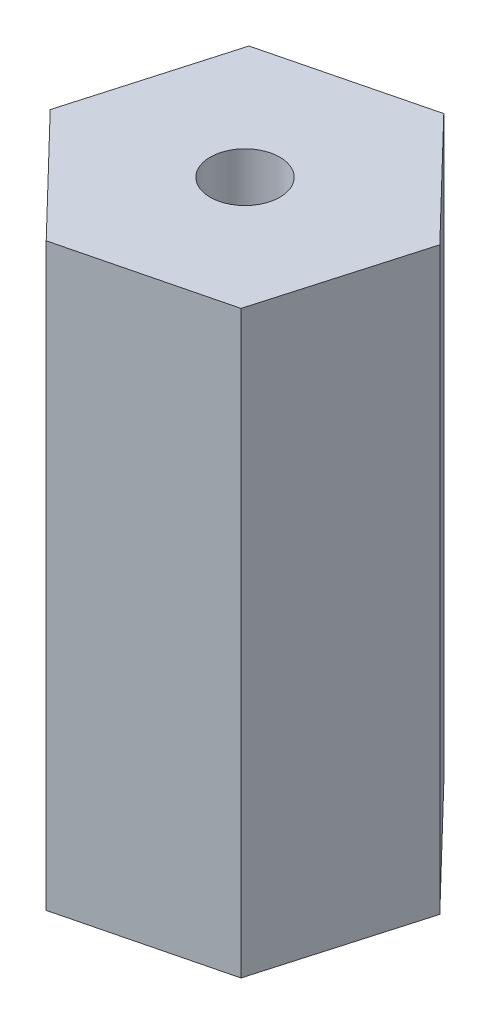
ISO-10303-21;
HEADER;
FILE_DESCRIPTION(('STEP AP214'),'2;1');
FILE_NAME('part.step','',(''),(''),'','','');
FILE_SCHEMA(('AUTOMOTIVE_DESIGN { 1 0 10303 214 1 1 1 1 }'));
ENDSEC;
DATA;
#1=APPLICATION_CONTEXT('core data for automotive mechanical design processes');
#2=APPLICATION_PROTOCOL_DEFINITION('international standard','automotive_design',2000,#1);
#3=PRODUCT_CONTEXT('',#1,'mechanical');
#4=PRODUCT('Part','Part','',(#3));
#5=PRODUCT_RELATED_PRODUCT_CATEGORY('part','',(#4));
#6=PRODUCT_DEFINITION_FORMATION('','',#4);
#7=PRODUCT_DEFINITION_CONTEXT('part definition',#1,'design');
#8=PRODUCT_DEFINITION('design','',#6,#7);
#9=PRODUCT_DEFINITION_SHAPE('','',#8);
#10=(LENGTH_UNIT() NAMED_UNIT(*) SI_UNIT(.MILLI.,.METRE.));
#11=(NAMED_UNIT(*) PLANE_ANGLE_UNIT() SI_UNIT($,.RADIAN.));
#12=(NAMED_UNIT(*) SI_UNIT($,.STERADIAN.) SOLID_ANGLE_UNIT());
#13=UNCERTAINTY_MEASURE_WITH_UNIT(LENGTH_MEASURE(1.E-05),#10,'distance_accuracy_value','');
#14=(GEOMETRIC_REPRESENTATION_CONTEXT(3) GLOBAL_UNCERTAINTY_ASSIGNED_CONTEXT((#13)) GLOBAL_UNIT_ASSIGNED_CONTEXT((#10,
#11,#12)) REPRESENTATION_CONTEXT('',''));
#15=CARTESIAN_POINT('',(0.,0.,0.));
#16=DIRECTION('',(0.,0.,1.));
#17=DIRECTION('',(1.,0.,0.));
#18=AXIS2_PLACEMENT_3D('',#15,#16,#17);
#19=CARTESIAN_POINT('',(-1.91026278693189,25.,6.65964684385465));
#20=DIRECTION('',(-0.241835763884429,0.,-0.970317197264088));
#21=DIRECTION('',(-0.970317197264088,0.,0.241835763884429));
#22=AXIS2_PLACEMENT_3D('',#19,#20,#21);
#23=PLANE('',#22);
#24=DIRECTION('',(0.970317197264088,0.,-0.241835763884429));
#25=VECTOR('',#24,1.);
#26=CARTESIAN_POINT('',(-1.91026278693189,0.,6.65964684385465));
#27=LINE('',#26,#25);
#28=CARTESIAN_POINT('',(-1.91026278693189,0.,6.65964684385465));
#29=VERTEX_POINT('',#28);
#30=CARTESIAN_POINT('',(4.81229195354504,0.,4.9841595233144));
#31=VERTEX_POINT('',#30);
#32=EDGE_CURVE('E117',#29,#31,#27,.T.);
#33=ORIENTED_EDGE('',*,*,#32,.T.);
#34=DIRECTION('',(0.,-1.,0.));
#35=VECTOR('',#34,1.);
#36=CARTESIAN_POINT('',(4.81229195354504,25.,4.9841595233144));
#37=LINE('',#36,#35);
#38=CARTESIAN_POINT('',(4.81229195354504,25.,4.9841595233144));
#39=VERTEX_POINT('',#38);
#40=EDGE_CURVE('E11',#39,#31,#37,.T.);
#41=ORIENTED_EDGE('',*,*,#40,.F.);
#42=DIRECTION('',(0.970317197264088,0.,-0.241835763884429));
#43=VECTOR('',#42,1.);
#44=CARTESIAN_POINT('',(-1.91026278693189,25.,6.65964684385465));
#45=LINE('',#44,#43);
#46=CARTESIAN_POINT('',(-1.91026278693189,25.,6.65964684385465));
#47=VERTEX_POINT('',#46);
#48=EDGE_CURVE('E128',#47,#39,#45,.T.);
#49=ORIENTED_EDGE('',*,*,#48,.F.);
#50=DIRECTION('',(0.,-1.,0.));
#51=VECTOR('',#50,1.);
#52=CARTESIAN_POINT('',(-1.91026278693189,25.,6.65964684385465));
#53=LINE('',#52,#51);
#54=EDGE_CURVE('E113',#47,#29,#53,.T.);
#55=ORIENTED_EDGE('',*,*,#54,.T.);
#56=EDGE_LOOP('',(#33,#41,#49,#55));
#57=FACE_BOUND('',#56,.T.);
#58=ADVANCED_FACE('F33',(#57),#23,.F.);
#59=CARTESIAN_POINT('',(4.81229195354504,25.,4.9841595233144));
#60=DIRECTION('',(-0.961237224501831,0.,-0.275722683564513));
#61=DIRECTION('',(-0.275722683564513,0.,0.961237224501831));
#62=AXIS2_PLACEMENT_3D('',#59,#60,#61);
#63=PLANE('',#62);
#64=DIRECTION('',(0.275722683564513,0.,-0.961237224501831));
#65=VECTOR('',#64,1.);
#66=CARTESIAN_POINT('',(4.81229195354504,0.,4.9841595233144));
#67=LINE('',#66,#65);
#68=CARTESIAN_POINT('',(6.72255474047693,0.,-1.67548732054025));
#69=VERTEX_POINT('',#68);
#70=EDGE_CURVE('E120',#31,#69,#67,.T.);
#71=ORIENTED_EDGE('',*,*,#70,.T.);
#72=DIRECTION('',(0.,-1.,0.));
#73=VECTOR('',#72,1.);
#74=CARTESIAN_POINT('',(6.72255474047693,25.,-1.67548732054025));
#75=LINE('',#74,#73);
#76=CARTESIAN_POINT('',(6.72255474047693,25.,-1.67548732054025));
#77=VERTEX_POINT('',#76);
#78=EDGE_CURVE('E41',#77,#69,#75,.T.);
#79=ORIENTED_EDGE('',*,*,#78,.F.);
#80=DIRECTION('',(0.275722683564513,0.,-0.961237224501831));
#81=VECTOR('',#80,1.);
#82=CARTESIAN_POINT('',(4.81229195354504,25.,4.9841595233144));
#83=LINE('',#82,#81);
#84=EDGE_CURVE('E86',#39,#77,#83,.T.);
#85=ORIENTED_EDGE('',*,*,#84,.F.);
#86=ORIENTED_EDGE('',*,*,#40,.T.);
#87=EDGE_LOOP('',(#71,#79,#85,#86));
#88=FACE_BOUND('',#87,.T.);
#89=ADVANCED_FACE('F153',(#88),#63,.F.);
#90=CARTESIAN_POINT('',(6.72255474047693,25.,-1.67548732054025));
#91=DIRECTION('',(-0.719401460617402,0.,0.694594513699575));
#92=DIRECTION('',(0.694594513699575,0.,0.719401460617402));
#93=AXIS2_PLACEMENT_3D('',#90,#91,#92);
#94=PLANE('',#93);
#95=DIRECTION('',(-0.694594513699575,0.,-0.719401460617402));
#96=VECTOR('',#95,1.);
#97=CARTESIAN_POINT('',(6.72255474047693,0.,-1.67548732054025));
#98=LINE('',#97,#96);
#99=CARTESIAN_POINT('',(1.91026278693189,0.,-6.65964684385465));
#100=VERTEX_POINT('',#99);
#101=EDGE_CURVE('E123',#69,#100,#98,.T.);
#102=ORIENTED_EDGE('',*,*,#101,.T.);
#103=DIRECTION('',(0.,-1.,0.));
#104=VECTOR('',#103,1.);
#105=CARTESIAN_POINT('',(1.91026278693189,25.,-6.65964684385465));
#106=LINE('',#105,#104);
#107=CARTESIAN_POINT('',(1.91026278693189,25.,-6.65964684385465));
#108=VERTEX_POINT('',#107);
#109=EDGE_CURVE('E108',#108,#100,#106,.T.);
#110=ORIENTED_EDGE('',*,*,#109,.F.);
#111=DIRECTION('',(-0.694594513699575,0.,-0.719401460617402));
#112=VECTOR('',#111,1.);
#113=CARTESIAN_POINT('',(6.72255474047693,25.,-1.67548732054025));
#114=LINE('',#113,#112);
#115=EDGE_CURVE('E99',#77,#108,#114,.T.);
#116=ORIENTED_EDGE('',*,*,#115,.F.);
#117=ORIENTED_EDGE('',*,*,#78,.T.);
#118=EDGE_LOOP('',(#102,#110,#116,#117));
#119=FACE_BOUND('',#118,.T.);
#120=ADVANCED_FACE('F134',(#119),#94,.F.);
#121=CARTESIAN_POINT('',(1.91026278693189,25.,-6.65964684385465));
#122=DIRECTION('',(0.241835763884429,0.,0.970317197264088));
#123=DIRECTION('',(0.970317197264088,0.,-0.241835763884429));
#124=AXIS2_PLACEMENT_3D('',#121,#122,#123);
#125=PLANE('',#124);
#126=DIRECTION('',(-0.970317197264088,0.,0.241835763884429));
#127=VECTOR('',#126,1.);
#128=CARTESIAN_POINT('',(1.91026278693189,0.,-6.65964684385465));
#129=LINE('',#128,#127);
#130=CARTESIAN_POINT('',(-4.81229195354504,0.,-4.9841595233144));
#131=VERTEX_POINT('',#130);
#132=EDGE_CURVE('E107',#100,#131,#129,.T.);
#133=ORIENTED_EDGE('',*,*,#132,.T.);
#134=DIRECTION('',(0.,-1.,0.));
#135=VECTOR('',#134,1.);
#136=CARTESIAN_POINT('',(-4.81229195354504,25.,-4.9841595233144));
#137=LINE('',#136,#135);
#138=CARTESIAN_POINT('',(-4.81229195354504,25.,-4.9841595233144));
#139=VERTEX_POINT('',#138);
#140=EDGE_CURVE('E104',#139,#131,#137,.T.);
#141=ORIENTED_EDGE('',*,*,#140,.F.);
#142=DIRECTION('',(-0.970317197264088,0.,0.241835763884429));
#143=VECTOR('',#142,1.);
#144=CARTESIAN_POINT('',(1.91026278693189,25.,-6.65964684385465));
#145=LINE('',#144,#143);
#146=EDGE_CURVE('E93',#108,#139,#145,.T.);
#147=ORIENTED_EDGE('',*,*,#146,.F.);
#148=ORIENTED_EDGE('',*,*,#109,.T.);
#149=EDGE_LOOP('',(#133,#141,#147,#148));
#150=FACE_BOUND('',#149,.T.);
#151=ADVANCED_FACE('F105',(#150),#125,.F.);
#152=CARTESIAN_POINT('',(-4.81229195354504,25.,-4.9841595233144));
#153=DIRECTION('',(0.961237224501831,0.,0.275722683564513));
#154=DIRECTION('',(0.275722683564513,0.,-0.961237224501831));
#155=AXIS2_PLACEMENT_3D('',#152,#153,#154);
#156=PLANE('',#155);
#157=DIRECTION('',(-0.275722683564513,0.,0.961237224501831));
#158=VECTOR('',#157,1.);
#159=CARTESIAN_POINT('',(-4.81229195354504,0.,-4.9841595233144));
#160=LINE('',#159,#158);
#161=CARTESIAN_POINT('',(-6.72255474047693,0.,1.67548732054025));
#162=VERTEX_POINT('',#161);
#163=EDGE_CURVE('E72',#131,#162,#160,.T.);
#164=ORIENTED_EDGE('',*,*,#163,.T.);
#165=DIRECTION('',(0.,-1.,0.));
#166=VECTOR('',#165,1.);
#167=CARTESIAN_POINT('',(-6.72255474047693,25.,1.67548732054025));
#168=LINE('',#167,#166);
#169=CARTESIAN_POINT('',(-6.72255474047693,25.,1.67548732054025));
#170=VERTEX_POINT('',#169);
#171=EDGE_CURVE('E109',#170,#162,#168,.T.);
#172=ORIENTED_EDGE('',*,*,#171,.F.);
#173=DIRECTION('',(-0.275722683564513,0.,0.961237224501831));
#174=VECTOR('',#173,1.);
#175=CARTESIAN_POINT('',(-4.81229195354504,25.,-4.9841595233144));
#176=LINE('',#175,#174);
#177=EDGE_CURVE('E97',#139,#170,#176,.T.);
#178=ORIENTED_EDGE('',*,*,#177,.F.);
#179=ORIENTED_EDGE('',*,*,#140,.T.);
#180=EDGE_LOOP('',(#164,#172,#178,#179));
#181=FACE_BOUND('',#180,.T.);
#182=ADVANCED_FACE('F111',(#181),#156,.F.);
#183=CARTESIAN_POINT('',(-6.72255474047693,25.,1.67548732054025));
#184=DIRECTION('',(0.719401460617402,0.,-0.694594513699575));
#185=DIRECTION('',(-0.694594513699575,0.,-0.719401460617402));
#186=AXIS2_PLACEMENT_3D('',#183,#184,#185);
#187=PLANE('',#186);
#188=DIRECTION('',(0.694594513699575,0.,0.719401460617402));
#189=VECTOR('',#188,1.);
#190=CARTESIAN_POINT('',(-6.72255474047693,0.,1.67548732054025));
#191=LINE('',#190,#189);
#192=EDGE_CURVE('E78',#162,#29,#191,.T.);
#193=ORIENTED_EDGE('',*,*,#192,.T.);
#194=ORIENTED_EDGE('',*,*,#54,.F.);
#195=DIRECTION('',(0.694594513699575,0.,0.719401460617402));
#196=VECTOR('',#195,1.);
#197=CARTESIAN_POINT('',(-6.72255474047693,25.,1.67548732054025));
#198=LINE('',#197,#196);
#199=EDGE_CURVE('E49',#170,#47,#198,.T.);
#200=ORIENTED_EDGE('',*,*,#199,.F.);
#201=ORIENTED_EDGE('',*,*,#171,.T.);
#202=EDGE_LOOP('',(#193,#194,#200,#201));
#203=FACE_BOUND('',#202,.T.);
#204=ADVANCED_FACE('F141',(#203),#187,.F.);
#205=CARTESIAN_POINT('',(0.,25.,0.));
#206=DIRECTION('',(0.,1.,0.));
#207=DIRECTION('',(0.,0.,1.));
#208=AXIS2_PLACEMENT_3D('',#205,#206,#207);
#209=PLANE('',#208);
#210=CARTESIAN_POINT('',(0.,25.,0.));
#211=DIRECTION('',(0.,1.,0.));
#212=DIRECTION('',(0.,0.,1.));
#213=AXIS2_PLACEMENT_3D('',#210,#211,#212);
#214=CIRCLE('',#213,1.5);
#215=CARTESIAN_POINT('',(0.,25.,1.5));
#216=VERTEX_POINT('',#215);
#217=EDGE_CURVE('E121',#216,#216,#214,.T.);
#218=ORIENTED_EDGE('',*,*,#217,.F.);
#219=EDGE_LOOP('',(#218));
#220=FACE_BOUND('',#219,.T.);
#221=ORIENTED_EDGE('',*,*,#48,.T.);
#222=ORIENTED_EDGE('',*,*,#84,.T.);
#223=ORIENTED_EDGE('',*,*,#115,.T.);
#224=ORIENTED_EDGE('',*,*,#146,.T.);
#225=ORIENTED_EDGE('',*,*,#177,.T.);
#226=ORIENTED_EDGE('',*,*,#199,.T.);
#227=EDGE_LOOP('',(#221,#222,#223,#224,#225,#226));
#228=FACE_BOUND('',#227,.T.);
#229=ADVANCED_FACE('F95',(#220,#228),#209,.T.);
#230=CARTESIAN_POINT('',(0.,0.,0.));
#231=DIRECTION('',(0.,1.,0.));
#232=DIRECTION('',(0.,0.,1.));
#233=AXIS2_PLACEMENT_3D('',#230,#231,#232);
#234=PLANE('',#233);
#235=CARTESIAN_POINT('',(0.,0.,0.));
#236=DIRECTION('',(0.,-1.,0.));
#237=DIRECTION('',(0.,0.,-1.));
#238=AXIS2_PLACEMENT_3D('',#235,#236,#237);
#239=CIRCLE('',#238,1.5);
#240=CARTESIAN_POINT('',(0.,0.,-1.5));
#241=VERTEX_POINT('',#240);
#242=EDGE_CURVE('E208',#241,#241,#239,.T.);
#243=ORIENTED_EDGE('',*,*,#242,.F.);
#244=EDGE_LOOP('',(#243));
#245=FACE_BOUND('',#244,.T.);
#246=ORIENTED_EDGE('',*,*,#32,.F.);
#247=ORIENTED_EDGE('',*,*,#192,.F.);
#248=ORIENTED_EDGE('',*,*,#163,.F.);
#249=ORIENTED_EDGE('',*,*,#132,.F.);
#250=ORIENTED_EDGE('',*,*,#101,.F.);
#251=ORIENTED_EDGE('',*,*,#70,.F.);
#252=EDGE_LOOP('',(#246,#247,#248,#249,#250,#251));
#253=FACE_BOUND('',#252,.T.);
#254=ADVANCED_FACE('F137',(#245,#253),#234,.F.);
#255=CARTESIAN_POINT('',(0.,30.,0.));
#256=DIRECTION('',(0.,-1.,0.));
#257=DIRECTION('',(0.,0.,-1.));
#258=AXIS2_PLACEMENT_3D('',#255,#256,#257);
#259=CYLINDRICAL_SURFACE('',#258,1.5);
#260=ORIENTED_EDGE('',*,*,#217,.T.);
#261=EDGE_LOOP('',(#260));
#262=FACE_BOUND('',#261,.T.);
#263=ORIENTED_EDGE('',*,*,#242,.T.);
#264=EDGE_LOOP('',(#263));
#265=FACE_BOUND('',#264,.T.);
#266=ADVANCED_FACE('F190',(#262,#265),#259,.F.);
#267=CLOSED_SHELL('',(#58,#89,#120,#151,#182,#204,#229,#254,#266));
#268=MANIFOLD_SOLID_BREP('B2',#267);
#269=ADVANCED_BREP_SHAPE_REPRESENTATION('',(#18,#268),#14);
#270=SHAPE_DEFINITION_REPRESENTATION(#9,#269);
ENDSEC;
END-ISO-10303-21;
